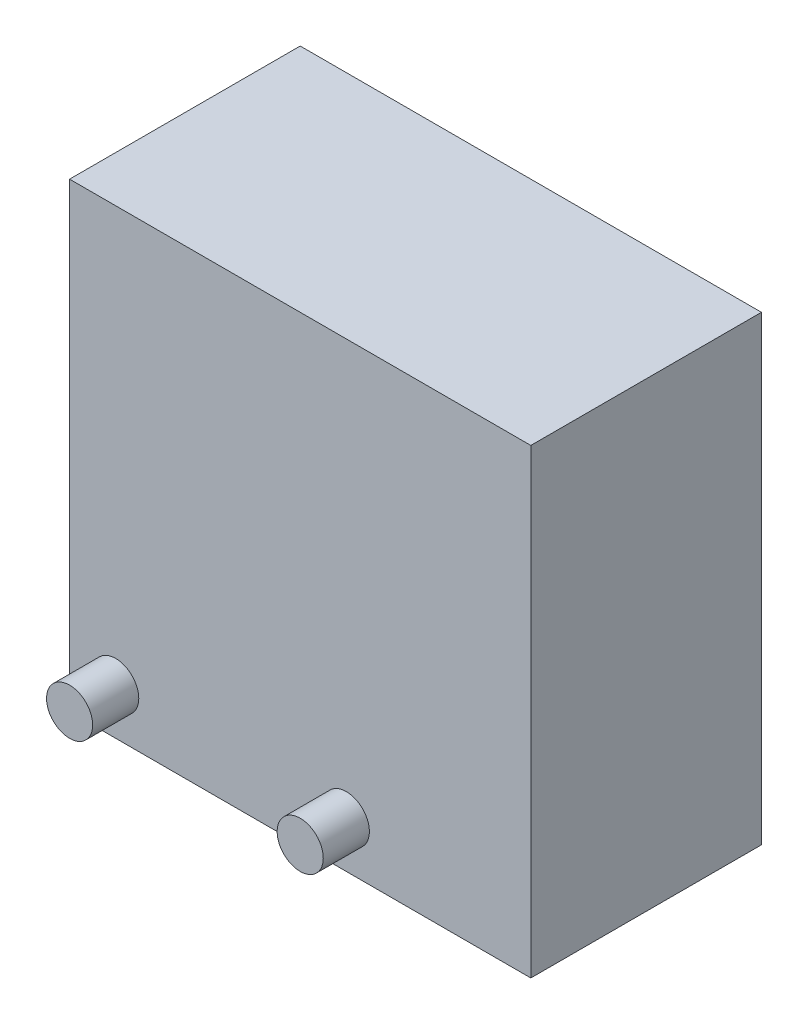
ISO-10303-21;
HEADER;
FILE_DESCRIPTION(('STEP AP214'),'2;1');
FILE_NAME('part.step','',(''),(''),'','','');
FILE_SCHEMA(('AUTOMOTIVE_DESIGN { 1 0 10303 214 1 1 1 1 }'));
ENDSEC;
DATA;
#1=APPLICATION_CONTEXT('core data for automotive mechanical design processes');
#2=APPLICATION_PROTOCOL_DEFINITION('international standard','automotive_design',2000,#1);
#3=PRODUCT_CONTEXT('',#1,'mechanical');
#4=PRODUCT('Part','Part','',(#3));
#5=PRODUCT_RELATED_PRODUCT_CATEGORY('part','',(#4));
#6=PRODUCT_DEFINITION_FORMATION('','',#4);
#7=PRODUCT_DEFINITION_CONTEXT('part definition',#1,'design');
#8=PRODUCT_DEFINITION('design','',#6,#7);
#9=PRODUCT_DEFINITION_SHAPE('','',#8);
#10=(LENGTH_UNIT() NAMED_UNIT(*) SI_UNIT(.MILLI.,.METRE.));
#11=(NAMED_UNIT(*) PLANE_ANGLE_UNIT() SI_UNIT($,.RADIAN.));
#12=(NAMED_UNIT(*) SI_UNIT($,.STERADIAN.) SOLID_ANGLE_UNIT());
#13=UNCERTAINTY_MEASURE_WITH_UNIT(LENGTH_MEASURE(1.E-05),#10,'distance_accuracy_value','');
#14=(GEOMETRIC_REPRESENTATION_CONTEXT(3) GLOBAL_UNCERTAINTY_ASSIGNED_CONTEXT((#13)) GLOBAL_UNIT_ASSIGNED_CONTEXT((#10,
#11,#12)) REPRESENTATION_CONTEXT('',''));
#15=CARTESIAN_POINT('',(0.,0.,0.));
#16=DIRECTION('',(0.,0.,1.));
#17=DIRECTION('',(1.,0.,0.));
#18=AXIS2_PLACEMENT_3D('',#15,#16,#17);
#19=CARTESIAN_POINT('',(0.,0.,10.));
#20=DIRECTION('',(1.,0.,0.));
#21=DIRECTION('',(0.,0.,-1.));
#22=AXIS2_PLACEMENT_3D('',#19,#20,#21);
#23=PLANE('',#22);
#24=DIRECTION('',(0.,-1.,0.));
#25=VECTOR('',#24,1.);
#26=CARTESIAN_POINT('',(0.,0.,0.));
#27=LINE('',#26,#25);
#28=CARTESIAN_POINT('',(0.,20.,0.));
#29=VERTEX_POINT('',#28);
#30=CARTESIAN_POINT('',(0.,0.,0.));
#31=VERTEX_POINT('',#30);
#32=EDGE_CURVE('E108',#29,#31,#27,.T.);
#33=ORIENTED_EDGE('',*,*,#32,.T.);
#34=DIRECTION('',(0.,0.,-1.));
#35=VECTOR('',#34,1.);
#36=CARTESIAN_POINT('',(0.,0.,10.));
#37=LINE('',#36,#35);
#38=CARTESIAN_POINT('',(0.,0.,10.));
#39=VERTEX_POINT('',#38);
#40=EDGE_CURVE('E99',#39,#31,#37,.T.);
#41=ORIENTED_EDGE('',*,*,#40,.F.);
#42=DIRECTION('',(0.,-1.,0.));
#43=VECTOR('',#42,1.);
#44=CARTESIAN_POINT('',(0.,0.,10.));
#45=LINE('',#44,#43);
#46=CARTESIAN_POINT('',(0.,20.,10.));
#47=VERTEX_POINT('',#46);
#48=EDGE_CURVE('E94',#47,#39,#45,.T.);
#49=ORIENTED_EDGE('',*,*,#48,.F.);
#50=DIRECTION('',(0.,0.,-1.));
#51=VECTOR('',#50,1.);
#52=CARTESIAN_POINT('',(0.,20.,10.));
#53=LINE('',#52,#51);
#54=EDGE_CURVE('E104',#47,#29,#53,.T.);
#55=ORIENTED_EDGE('',*,*,#54,.T.);
#56=EDGE_LOOP('',(#33,#41,#49,#55));
#57=FACE_BOUND('',#56,.T.);
#58=ADVANCED_FACE('F45',(#57),#23,.F.);
#59=CARTESIAN_POINT('',(0.,0.,10.));
#60=DIRECTION('',(0.,1.,0.));
#61=DIRECTION('',(0.,0.,1.));
#62=AXIS2_PLACEMENT_3D('',#59,#60,#61);
#63=PLANE('',#62);
#64=DIRECTION('',(1.,0.,0.));
#65=VECTOR('',#64,1.);
#66=CARTESIAN_POINT('',(0.,0.,0.));
#67=LINE('',#66,#65);
#68=CARTESIAN_POINT('',(20.,0.,0.));
#69=VERTEX_POINT('',#68);
#70=EDGE_CURVE('E97',#31,#69,#67,.T.);
#71=ORIENTED_EDGE('',*,*,#70,.T.);
#72=DIRECTION('',(0.,0.,-1.));
#73=VECTOR('',#72,1.);
#74=CARTESIAN_POINT('',(20.,0.,10.));
#75=LINE('',#74,#73);
#76=CARTESIAN_POINT('',(20.,0.,10.));
#77=VERTEX_POINT('',#76);
#78=EDGE_CURVE('E100',#77,#69,#75,.T.);
#79=ORIENTED_EDGE('',*,*,#78,.F.);
#80=DIRECTION('',(1.,0.,0.));
#81=VECTOR('',#80,1.);
#82=CARTESIAN_POINT('',(0.,0.,10.));
#83=LINE('',#82,#81);
#84=EDGE_CURVE('E90',#39,#77,#83,.T.);
#85=ORIENTED_EDGE('',*,*,#84,.F.);
#86=ORIENTED_EDGE('',*,*,#40,.T.);
#87=EDGE_LOOP('',(#71,#79,#85,#86));
#88=FACE_BOUND('',#87,.T.);
#89=ADVANCED_FACE('F98',(#88),#63,.F.);
#90=CARTESIAN_POINT('',(20.,0.,10.));
#91=DIRECTION('',(-1.,0.,0.));
#92=DIRECTION('',(0.,0.,1.));
#93=AXIS2_PLACEMENT_3D('',#90,#91,#92);
#94=PLANE('',#93);
#95=DIRECTION('',(0.,1.,0.));
#96=VECTOR('',#95,1.);
#97=CARTESIAN_POINT('',(20.,0.,0.));
#98=LINE('',#97,#96);
#99=CARTESIAN_POINT('',(20.,20.,0.));
#100=VERTEX_POINT('',#99);
#101=EDGE_CURVE('E73',#69,#100,#98,.T.);
#102=ORIENTED_EDGE('',*,*,#101,.T.);
#103=DIRECTION('',(0.,0.,-1.));
#104=VECTOR('',#103,1.);
#105=CARTESIAN_POINT('',(20.,20.,10.));
#106=LINE('',#105,#104);
#107=CARTESIAN_POINT('',(20.,20.,10.));
#108=VERTEX_POINT('',#107);
#109=EDGE_CURVE('E101',#108,#100,#106,.T.);
#110=ORIENTED_EDGE('',*,*,#109,.F.);
#111=DIRECTION('',(0.,1.,0.));
#112=VECTOR('',#111,1.);
#113=CARTESIAN_POINT('',(20.,0.,10.));
#114=LINE('',#113,#112);
#115=EDGE_CURVE('E95',#77,#108,#114,.T.);
#116=ORIENTED_EDGE('',*,*,#115,.F.);
#117=ORIENTED_EDGE('',*,*,#78,.T.);
#118=EDGE_LOOP('',(#102,#110,#116,#117));
#119=FACE_BOUND('',#118,.T.);
#120=ADVANCED_FACE('F103',(#119),#94,.F.);
#121=CARTESIAN_POINT('',(0.,20.,10.));
#122=DIRECTION('',(0.,-1.,0.));
#123=DIRECTION('',(0.,0.,-1.));
#124=AXIS2_PLACEMENT_3D('',#121,#122,#123);
#125=PLANE('',#124);
#126=DIRECTION('',(-1.,0.,0.));
#127=VECTOR('',#126,1.);
#128=CARTESIAN_POINT('',(0.,20.,0.));
#129=LINE('',#128,#127);
#130=EDGE_CURVE('E82',#100,#29,#129,.T.);
#131=ORIENTED_EDGE('',*,*,#130,.T.);
#132=ORIENTED_EDGE('',*,*,#54,.F.);
#133=DIRECTION('',(-1.,0.,0.));
#134=VECTOR('',#133,1.);
#135=CARTESIAN_POINT('',(0.,20.,10.));
#136=LINE('',#135,#134);
#137=EDGE_CURVE('E59',#108,#47,#136,.T.);
#138=ORIENTED_EDGE('',*,*,#137,.F.);
#139=ORIENTED_EDGE('',*,*,#109,.T.);
#140=EDGE_LOOP('',(#131,#132,#138,#139));
#141=FACE_BOUND('',#140,.T.);
#142=ADVANCED_FACE('F136',(#141),#125,.F.);
#143=CARTESIAN_POINT('',(0.,0.,10.));
#144=DIRECTION('',(0.,0.,-1.));
#145=DIRECTION('',(-1.,0.,0.));
#146=AXIS2_PLACEMENT_3D('',#143,#144,#145);
#147=PLANE('',#146);
#148=CARTESIAN_POINT('',(12.,2.,10.));
#149=DIRECTION('',(0.,0.,-1.));
#150=DIRECTION('',(-1.,0.,0.));
#151=AXIS2_PLACEMENT_3D('',#148,#149,#150);
#152=CIRCLE('',#151,1.);
#153=CARTESIAN_POINT('',(11.,2.,10.));
#154=VERTEX_POINT('',#153);
#155=EDGE_CURVE('E11',#154,#154,#152,.F.);
#156=ORIENTED_EDGE('',*,*,#155,.F.);
#157=EDGE_LOOP('',(#156));
#158=FACE_BOUND('',#157,.T.);
#159=CARTESIAN_POINT('',(2.,2.,10.));
#160=DIRECTION('',(0.,0.,1.));
#161=DIRECTION('',(1.,0.,0.));
#162=AXIS2_PLACEMENT_3D('',#159,#160,#161);
#163=CIRCLE('',#162,1.);
#164=CARTESIAN_POINT('',(3.,2.,10.));
#165=VERTEX_POINT('',#164);
#166=EDGE_CURVE('E49',#165,#165,#163,.T.);
#167=ORIENTED_EDGE('',*,*,#166,.F.);
#168=EDGE_LOOP('',(#167));
#169=FACE_BOUND('',#168,.T.);
#170=ORIENTED_EDGE('',*,*,#48,.T.);
#171=ORIENTED_EDGE('',*,*,#84,.T.);
#172=ORIENTED_EDGE('',*,*,#115,.T.);
#173=ORIENTED_EDGE('',*,*,#137,.T.);
#174=EDGE_LOOP('',(#170,#171,#172,#173));
#175=FACE_BOUND('',#174,.T.);
#176=ADVANCED_FACE('F89',(#158,#169,#175),#147,.F.);
#177=CARTESIAN_POINT('',(0.,0.,0.));
#178=DIRECTION('',(0.,0.,-1.));
#179=DIRECTION('',(-1.,0.,0.));
#180=AXIS2_PLACEMENT_3D('',#177,#178,#179);
#181=PLANE('',#180);
#182=ORIENTED_EDGE('',*,*,#32,.F.);
#183=ORIENTED_EDGE('',*,*,#130,.F.);
#184=ORIENTED_EDGE('',*,*,#101,.F.);
#185=ORIENTED_EDGE('',*,*,#70,.F.);
#186=EDGE_LOOP('',(#182,#183,#184,#185));
#187=FACE_BOUND('',#186,.T.);
#188=ADVANCED_FACE('F139',(#187),#181,.T.);
#189=CARTESIAN_POINT('',(2.,2.,12.));
#190=DIRECTION('',(0.,0.,-1.));
#191=DIRECTION('',(-1.,0.,0.));
#192=AXIS2_PLACEMENT_3D('',#189,#190,#191);
#193=CYLINDRICAL_SURFACE('',#192,1.);
#194=CARTESIAN_POINT('',(2.,2.,12.));
#195=DIRECTION('',(0.,0.,1.));
#196=DIRECTION('',(1.,0.,0.));
#197=AXIS2_PLACEMENT_3D('',#194,#195,#196);
#198=CIRCLE('',#197,1.);
#199=CARTESIAN_POINT('',(3.,2.,12.));
#200=VERTEX_POINT('',#199);
#201=EDGE_CURVE('E115',#200,#200,#198,.T.);
#202=ORIENTED_EDGE('',*,*,#201,.F.);
#203=EDGE_LOOP('',(#202));
#204=FACE_BOUND('',#203,.T.);
#205=ORIENTED_EDGE('',*,*,#166,.T.);
#206=EDGE_LOOP('',(#205));
#207=FACE_BOUND('',#206,.T.);
#208=ADVANCED_FACE('F148',(#204,#207),#193,.T.);
#209=CARTESIAN_POINT('',(2.,2.,12.));
#210=DIRECTION('',(0.,0.,1.));
#211=DIRECTION('',(1.,0.,0.));
#212=AXIS2_PLACEMENT_3D('',#209,#210,#211);
#213=PLANE('',#212);
#214=ORIENTED_EDGE('',*,*,#201,.T.);
#215=EDGE_LOOP('',(#214));
#216=FACE_BOUND('',#215,.T.);
#217=ADVANCED_FACE('F132',(#216),#213,.T.);
#218=CARTESIAN_POINT('',(12.,2.,12.));
#219=DIRECTION('',(0.,0.,-1.));
#220=DIRECTION('',(-1.,0.,0.));
#221=AXIS2_PLACEMENT_3D('',#218,#219,#220);
#222=CYLINDRICAL_SURFACE('',#221,1.);
#223=CARTESIAN_POINT('',(12.,2.,12.));
#224=DIRECTION('',(0.,0.,1.));
#225=DIRECTION('',(1.,0.,0.));
#226=AXIS2_PLACEMENT_3D('',#223,#224,#225);
#227=CIRCLE('',#226,1.);
#228=CARTESIAN_POINT('',(13.,2.,12.));
#229=VERTEX_POINT('',#228);
#230=EDGE_CURVE('E122',#229,#229,#227,.T.);
#231=ORIENTED_EDGE('',*,*,#230,.F.);
#232=EDGE_LOOP('',(#231));
#233=FACE_BOUND('',#232,.T.);
#234=ORIENTED_EDGE('',*,*,#155,.T.);
#235=EDGE_LOOP('',(#234));
#236=FACE_BOUND('',#235,.T.);
#237=ADVANCED_FACE('F128',(#233,#236),#222,.T.);
#238=CARTESIAN_POINT('',(12.,2.,12.));
#239=DIRECTION('',(0.,0.,1.));
#240=DIRECTION('',(1.,0.,0.));
#241=AXIS2_PLACEMENT_3D('',#238,#239,#240);
#242=PLANE('',#241);
#243=ORIENTED_EDGE('',*,*,#230,.T.);
#244=EDGE_LOOP('',(#243));
#245=FACE_BOUND('',#244,.T.);
#246=ADVANCED_FACE('F126',(#245),#242,.T.);
#247=CLOSED_SHELL('',(#58,#89,#120,#142,#176,#188,#208,#217,#237,#246));
#248=MANIFOLD_SOLID_BREP('B2',#247);
#249=ADVANCED_BREP_SHAPE_REPRESENTATION('',(#18,#248),#14);
#250=SHAPE_DEFINITION_REPRESENTATION(#9,#249);
ENDSEC;
END-ISO-10303-21;
